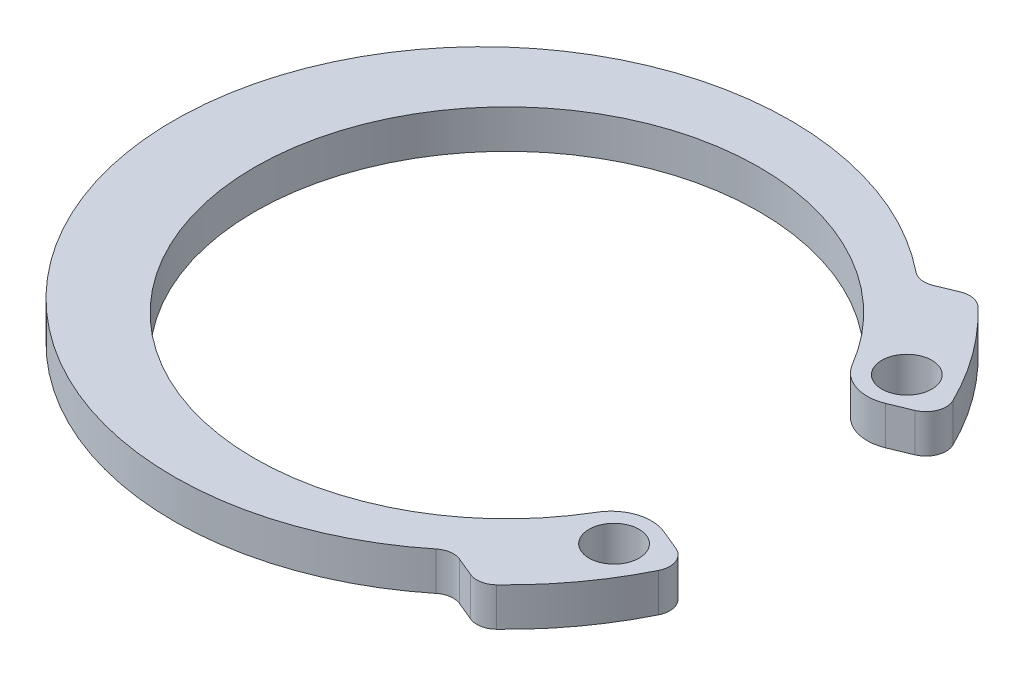
ISO-10303-21;
HEADER;
FILE_DESCRIPTION(('STEP AP214'),'2;1');
FILE_NAME('part.step','',(''),(''),'','','');
FILE_SCHEMA(('AUTOMOTIVE_DESIGN { 1 0 10303 214 1 1 1 1 }'));
ENDSEC;
DATA;
#1=APPLICATION_CONTEXT('core data for automotive mechanical design processes');
#2=APPLICATION_PROTOCOL_DEFINITION('international standard','automotive_design',2000,#1);
#3=PRODUCT_CONTEXT('',#1,'mechanical');
#4=PRODUCT('Part','Part','',(#3));
#5=PRODUCT_RELATED_PRODUCT_CATEGORY('part','',(#4));
#6=PRODUCT_DEFINITION_FORMATION('','',#4);
#7=PRODUCT_DEFINITION_CONTEXT('part definition',#1,'design');
#8=PRODUCT_DEFINITION('design','',#6,#7);
#9=PRODUCT_DEFINITION_SHAPE('','',#8);
#10=(LENGTH_UNIT() NAMED_UNIT(*) SI_UNIT(.MILLI.,.METRE.));
#11=(NAMED_UNIT(*) PLANE_ANGLE_UNIT() SI_UNIT($,.RADIAN.));
#12=(NAMED_UNIT(*) SI_UNIT($,.STERADIAN.) SOLID_ANGLE_UNIT());
#13=UNCERTAINTY_MEASURE_WITH_UNIT(LENGTH_MEASURE(1.E-05),#10,'distance_accuracy_value','');
#14=(GEOMETRIC_REPRESENTATION_CONTEXT(3) GLOBAL_UNCERTAINTY_ASSIGNED_CONTEXT((#13)) GLOBAL_UNIT_ASSIGNED_CONTEXT((#10,
#11,#12)) REPRESENTATION_CONTEXT('',''));
#15=CARTESIAN_POINT('',(0.,0.,0.));
#16=DIRECTION('',(0.,0.,1.));
#17=DIRECTION('',(1.,0.,0.));
#18=AXIS2_PLACEMENT_3D('',#15,#16,#17);
#19=CARTESIAN_POINT('',(5.61642550601752,0.5,5.87123407260824));
#20=DIRECTION('',(0.,1.,0.));
#21=DIRECTION('',(0.,0.,1.));
#22=AXIS2_PLACEMENT_3D('',#19,#20,#21);
#23=PLANE('',#22);
#24=CARTESIAN_POINT('',(6.58179306876173,0.5,3.80000000000001));
#25=DIRECTION('',(0.,1.,0.));
#26=DIRECTION('',(0.,0.,1.));
#27=AXIS2_PLACEMENT_3D('',#24,#25,#26);
#28=CIRCLE('',#27,0.65);
#29=CARTESIAN_POINT('',(6.58179306876173,0.5,4.45000000000001));
#30=VERTEX_POINT('',#29);
#31=EDGE_CURVE('E220',#30,#30,#28,.T.);
#32=ORIENTED_EDGE('',*,*,#31,.F.);
#33=EDGE_LOOP('',(#32));
#34=FACE_BOUND('',#33,.T.);
#35=CARTESIAN_POINT('',(5.61642550601752,0.5,5.87123407260824));
#36=DIRECTION('',(0.,1.,0.));
#37=DIRECTION('',(0.,0.,1.));
#38=AXIS2_PLACEMENT_3D('',#35,#36,#37);
#39=CIRCLE('',#38,0.524999999999999);
#40=CARTESIAN_POINT('',(5.41551670402585,0.5,6.35627082717666));
#41=VERTEX_POINT('',#40);
#42=CARTESIAN_POINT('',(5.9793330002525,0.5,6.25060612037677));
#43=VERTEX_POINT('',#42);
#44=EDGE_CURVE('E223',#41,#43,#39,.T.);
#45=ORIENTED_EDGE('',*,*,#44,.T.);
#46=CARTESIAN_POINT('',(0.,0.5,0.));
#47=DIRECTION('',(0.,1.,0.));
#48=DIRECTION('',(0.,0.,1.));
#49=AXIS2_PLACEMENT_3D('',#46,#47,#48);
#50=CIRCLE('',#49,8.65);
#51=CARTESIAN_POINT('',(7.76096693648027,0.5,3.81967174124427));
#52=VERTEX_POINT('',#51);
#53=EDGE_CURVE('E155',#43,#52,#50,.T.);
#54=ORIENTED_EDGE('',*,*,#53,.T.);
#55=CARTESIAN_POINT('',(7.28992559062453,0.5,3.58784195348089));
#56=DIRECTION('',(0.,1.,0.));
#57=DIRECTION('',(0.,0.,-1.));
#58=AXIS2_PLACEMENT_3D('',#55,#56,#57);
#59=CIRCLE('',#58,0.524999999999999);
#60=CARTESIAN_POINT('',(7.4908343926162,0.5,3.10280519891247));
#61=VERTEX_POINT('',#60);
#62=EDGE_CURVE('E226',#52,#61,#59,.T.);
#63=ORIENTED_EDGE('',*,*,#62,.T.);
#64=DIRECTION('',(-0.923879532511286,0.,-0.382683432365091));
#65=VECTOR('',#64,1.);
#66=CARTESIAN_POINT('',(6.95414992846274,0.5,2.88050321514516));
#67=LINE('',#66,#65);
#68=CARTESIAN_POINT('',(6.95414992846274,0.5,2.88050321514516));
#69=VERTEX_POINT('',#68);
#70=EDGE_CURVE('E228',#61,#69,#67,.T.);
#71=ORIENTED_EDGE('',*,*,#70,.T.);
#72=CARTESIAN_POINT('',(6.5523323244794,0.5,3.85057672428201));
#73=DIRECTION('',(0.,1.,0.));
#74=DIRECTION('',(0.,0.,1.));
#75=AXIS2_PLACEMENT_3D('',#72,#73,#74);
#76=CIRCLE('',#75,1.05);
#77=CARTESIAN_POINT('',(5.64707588491316,0.5,3.31858915053253));
#78=VERTEX_POINT('',#77);
#79=EDGE_CURVE('E230',#69,#78,#76,.T.);
#80=ORIENTED_EDGE('',*,*,#79,.T.);
#81=CARTESIAN_POINT('',(0.,0.5,0.));
#82=DIRECTION('',(0.,-1.,0.));
#83=DIRECTION('',(0.,0.,1.));
#84=AXIS2_PLACEMENT_3D('',#81,#82,#83);
#85=CIRCLE('',#84,6.55);
#86=CARTESIAN_POINT('',(5.64707588491317,0.5,-3.31858915053252));
#87=VERTEX_POINT('',#86);
#88=EDGE_CURVE('E232',#78,#87,#85,.T.);
#89=ORIENTED_EDGE('',*,*,#88,.T.);
#90=CARTESIAN_POINT('',(6.5523323244794,0.5,-3.85057672428201));
#91=DIRECTION('',(0.,1.,0.));
#92=DIRECTION('',(0.,0.,-1.));
#93=AXIS2_PLACEMENT_3D('',#90,#91,#92);
#94=CIRCLE('',#93,1.05);
#95=CARTESIAN_POINT('',(6.95414992846274,0.5,-2.88050321514516));
#96=VERTEX_POINT('',#95);
#97=EDGE_CURVE('E234',#87,#96,#94,.T.);
#98=ORIENTED_EDGE('',*,*,#97,.T.);
#99=DIRECTION('',(0.923879532511286,0.,-0.382683432365092));
#100=VECTOR('',#99,1.);
#101=CARTESIAN_POINT('',(6.95414992846274,0.5,-2.88050321514516));
#102=LINE('',#101,#100);
#103=CARTESIAN_POINT('',(7.4908343926162,0.5,-3.10280519891246));
#104=VERTEX_POINT('',#103);
#105=EDGE_CURVE('E236',#96,#104,#102,.T.);
#106=ORIENTED_EDGE('',*,*,#105,.T.);
#107=CARTESIAN_POINT('',(7.28992559062453,0.5,-3.58784195348089));
#108=DIRECTION('',(0.,1.,0.));
#109=DIRECTION('',(0.,0.,1.));
#110=AXIS2_PLACEMENT_3D('',#107,#108,#109);
#111=CIRCLE('',#110,0.525);
#112=CARTESIAN_POINT('',(7.76096693648027,0.5,-3.81967174124427));
#113=VERTEX_POINT('',#112);
#114=EDGE_CURVE('E238',#104,#113,#111,.T.);
#115=ORIENTED_EDGE('',*,*,#114,.T.);
#116=CARTESIAN_POINT('',(0.,0.5,0.));
#117=DIRECTION('',(0.,1.,0.));
#118=DIRECTION('',(0.,0.,-1.));
#119=AXIS2_PLACEMENT_3D('',#116,#117,#118);
#120=CIRCLE('',#119,8.65);
#121=CARTESIAN_POINT('',(5.97933300025249,0.5,-6.25060612037677));
#122=VERTEX_POINT('',#121);
#123=EDGE_CURVE('E240',#113,#122,#120,.T.);
#124=ORIENTED_EDGE('',*,*,#123,.T.);
#125=CARTESIAN_POINT('',(5.61642550601752,0.5,-5.87123407260824));
#126=DIRECTION('',(0.,1.,0.));
#127=DIRECTION('',(0.,0.,-1.));
#128=AXIS2_PLACEMENT_3D('',#125,#126,#127);
#129=CIRCLE('',#128,0.524999999999999);
#130=CARTESIAN_POINT('',(5.41551670402584,0.5,-6.35627082717666));
#131=VERTEX_POINT('',#130);
#132=EDGE_CURVE('E242',#122,#131,#129,.T.);
#133=ORIENTED_EDGE('',*,*,#132,.T.);
#134=DIRECTION('',(-0.923879532511287,0.,0.38268343236509));
#135=VECTOR('',#134,1.);
#136=CARTESIAN_POINT('',(4.92107566196852,0.5,-6.15146664176263));
#137=LINE('',#136,#135);
#138=CARTESIAN_POINT('',(4.92107566196851,0.5,-6.15146664176263));
#139=VERTEX_POINT('',#138);
#140=EDGE_CURVE('E244',#131,#139,#137,.T.);
#141=ORIENTED_EDGE('',*,*,#140,.T.);
#142=CARTESIAN_POINT('',(4.72016685997684,0.5,-6.63650339633106));
#143=DIRECTION('',(0.,-1.,0.));
#144=DIRECTION('',(0.,0.,1.));
#145=AXIS2_PLACEMENT_3D('',#142,#143,#144);
#146=CIRCLE('',#145,0.524999999999999);
#147=CARTESIAN_POINT('',(4.39019706640736,0.5,-6.2281592579726));
#148=VERTEX_POINT('',#147);
#149=EDGE_CURVE('E246',#139,#148,#146,.T.);
#150=ORIENTED_EDGE('',*,*,#149,.T.);
#151=CARTESIAN_POINT('',(-0.642578554990179,0.5,0.));
#152=DIRECTION('',(0.,1.,0.));
#153=DIRECTION('',(0.,0.,1.));
#154=AXIS2_PLACEMENT_3D('',#151,#152,#153);
#155=CIRCLE('',#154,8.00742144500982);
#156=CARTESIAN_POINT('',(4.39019706640737,0.5,6.22815925797259));
#157=VERTEX_POINT('',#156);
#158=EDGE_CURVE('E248',#148,#157,#155,.T.);
#159=ORIENTED_EDGE('',*,*,#158,.T.);
#160=CARTESIAN_POINT('',(4.72016685997685,0.5,6.63650339633105));
#161=DIRECTION('',(0.,-1.,0.));
#162=DIRECTION('',(0.,0.,-1.));
#163=AXIS2_PLACEMENT_3D('',#160,#161,#162);
#164=CIRCLE('',#163,0.524999999999999);
#165=CARTESIAN_POINT('',(4.92107566196852,0.5,6.15146664176263));
#166=VERTEX_POINT('',#165);
#167=EDGE_CURVE('E59',#157,#166,#164,.T.);
#168=ORIENTED_EDGE('',*,*,#167,.T.);
#169=DIRECTION('',(0.923879532511287,0.,0.382683432365089));
#170=VECTOR('',#169,1.);
#171=CARTESIAN_POINT('',(4.92107566196852,0.5,6.15146664176263));
#172=LINE('',#171,#170);
#173=EDGE_CURVE('E54',#166,#41,#172,.T.);
#174=ORIENTED_EDGE('',*,*,#173,.T.);
#175=EDGE_LOOP('',(#45,#54,#63,#71,#80,#89,#98,#106,#115,#124,#133,#141,#150,#159,#168,#174));
#176=FACE_BOUND('',#175,.T.);
#177=CARTESIAN_POINT('',(6.58179306876173,0.5,-3.80000000000001));
#178=DIRECTION('',(0.,1.,0.));
#179=DIRECTION('',(0.,0.,1.));
#180=AXIS2_PLACEMENT_3D('',#177,#178,#179);
#181=CIRCLE('',#180,0.65);
#182=CARTESIAN_POINT('',(6.58179306876173,0.5,-3.15000000000001));
#183=VERTEX_POINT('',#182);
#184=EDGE_CURVE('E217',#183,#183,#181,.T.);
#185=ORIENTED_EDGE('',*,*,#184,.F.);
#186=EDGE_LOOP('',(#185));
#187=FACE_BOUND('',#186,.T.);
#188=ADVANCED_FACE('F39',(#34,#176,#187),#23,.T.);
#189=CARTESIAN_POINT('',(5.61642550601752,0.5,5.87123407260824));
#190=DIRECTION('',(0.,-1.,0.));
#191=DIRECTION('',(0.,0.,-1.));
#192=AXIS2_PLACEMENT_3D('',#189,#190,#191);
#193=CYLINDRICAL_SURFACE('',#192,0.524999999999999);
#194=DIRECTION('',(0.,-1.,0.));
#195=VECTOR('',#194,1.);
#196=CARTESIAN_POINT('',(5.41551670402585,0.5,6.35627082717666));
#197=LINE('',#196,#195);
#198=CARTESIAN_POINT('',(5.41551670402585,-0.5,6.35627082717666));
#199=VERTEX_POINT('',#198);
#200=EDGE_CURVE('E170',#41,#199,#197,.T.);
#201=ORIENTED_EDGE('',*,*,#200,.T.);
#202=CARTESIAN_POINT('',(5.61642550601752,-0.5,5.87123407260824));
#203=DIRECTION('',(0.,1.,0.));
#204=DIRECTION('',(0.,0.,1.));
#205=AXIS2_PLACEMENT_3D('',#202,#203,#204);
#206=CIRCLE('',#205,0.524999999999999);
#207=CARTESIAN_POINT('',(5.9793330002525,-0.5,6.25060612037677));
#208=VERTEX_POINT('',#207);
#209=EDGE_CURVE('E164',#199,#208,#206,.T.);
#210=ORIENTED_EDGE('',*,*,#209,.T.);
#211=DIRECTION('',(0.,-1.,0.));
#212=VECTOR('',#211,1.);
#213=CARTESIAN_POINT('',(5.9793330002525,0.5,6.25060612037677));
#214=LINE('',#213,#212);
#215=EDGE_CURVE('E11',#43,#208,#214,.T.);
#216=ORIENTED_EDGE('',*,*,#215,.F.);
#217=ORIENTED_EDGE('',*,*,#44,.F.);
#218=EDGE_LOOP('',(#201,#210,#216,#217));
#219=FACE_BOUND('',#218,.T.);
#220=ADVANCED_FACE('F41',(#219),#193,.T.);
#221=CARTESIAN_POINT('',(0.,0.5,0.));
#222=DIRECTION('',(0.,-1.,0.));
#223=DIRECTION('',(0.,0.,-1.));
#224=AXIS2_PLACEMENT_3D('',#221,#222,#223);
#225=CYLINDRICAL_SURFACE('',#224,8.65);
#226=ORIENTED_EDGE('',*,*,#215,.T.);
#227=CARTESIAN_POINT('',(0.,-0.5,0.));
#228=DIRECTION('',(0.,1.,0.));
#229=DIRECTION('',(0.,0.,1.));
#230=AXIS2_PLACEMENT_3D('',#227,#228,#229);
#231=CIRCLE('',#230,8.65);
#232=CARTESIAN_POINT('',(7.76096693648027,-0.5,3.81967174124427));
#233=VERTEX_POINT('',#232);
#234=EDGE_CURVE('E154',#208,#233,#231,.T.);
#235=ORIENTED_EDGE('',*,*,#234,.T.);
#236=DIRECTION('',(0.,-1.,0.));
#237=VECTOR('',#236,1.);
#238=CARTESIAN_POINT('',(7.76096693648027,0.5,3.81967174124427));
#239=LINE('',#238,#237);
#240=EDGE_CURVE('E47',#52,#233,#239,.T.);
#241=ORIENTED_EDGE('',*,*,#240,.F.);
#242=ORIENTED_EDGE('',*,*,#53,.F.);
#243=EDGE_LOOP('',(#226,#235,#241,#242));
#244=FACE_BOUND('',#243,.T.);
#245=ADVANCED_FACE('F152',(#244),#225,.T.);
#246=CARTESIAN_POINT('',(7.28992559062453,0.5,3.58784195348089));
#247=DIRECTION('',(0.,-1.,0.));
#248=DIRECTION('',(0.,0.,-1.));
#249=AXIS2_PLACEMENT_3D('',#246,#247,#248);
#250=CYLINDRICAL_SURFACE('',#249,0.524999999999999);
#251=ORIENTED_EDGE('',*,*,#240,.T.);
#252=CARTESIAN_POINT('',(7.28992559062453,-0.5,3.58784195348089));
#253=DIRECTION('',(0.,1.,0.));
#254=DIRECTION('',(0.,0.,-1.));
#255=AXIS2_PLACEMENT_3D('',#252,#253,#254);
#256=CIRCLE('',#255,0.524999999999999);
#257=CARTESIAN_POINT('',(7.4908343926162,-0.5,3.10280519891247));
#258=VERTEX_POINT('',#257);
#259=EDGE_CURVE('E168',#233,#258,#256,.T.);
#260=ORIENTED_EDGE('',*,*,#259,.T.);
#261=DIRECTION('',(0.,-1.,0.));
#262=VECTOR('',#261,1.);
#263=CARTESIAN_POINT('',(7.4908343926162,0.5,3.10280519891247));
#264=LINE('',#263,#262);
#265=EDGE_CURVE('E277',#61,#258,#264,.T.);
#266=ORIENTED_EDGE('',*,*,#265,.F.);
#267=ORIENTED_EDGE('',*,*,#62,.F.);
#268=EDGE_LOOP('',(#251,#260,#266,#267));
#269=FACE_BOUND('',#268,.T.);
#270=ADVANCED_FACE('F280',(#269),#250,.T.);
#271=CARTESIAN_POINT('',(6.95414992846274,0.5,2.88050321514516));
#272=DIRECTION('',(-0.382683432365091,0.,0.923879532511286));
#273=DIRECTION('',(0.923879532511286,0.,0.382683432365091));
#274=AXIS2_PLACEMENT_3D('',#271,#272,#273);
#275=PLANE('',#274);
#276=ORIENTED_EDGE('',*,*,#265,.T.);
#277=DIRECTION('',(-0.923879532511286,0.,-0.382683432365091));
#278=VECTOR('',#277,1.);
#279=CARTESIAN_POINT('',(6.95414992846274,-0.5,2.88050321514516));
#280=LINE('',#279,#278);
#281=CARTESIAN_POINT('',(6.95414992846274,-0.5,2.88050321514516));
#282=VERTEX_POINT('',#281);
#283=EDGE_CURVE('E179',#258,#282,#280,.T.);
#284=ORIENTED_EDGE('',*,*,#283,.T.);
#285=DIRECTION('',(0.,-1.,0.));
#286=VECTOR('',#285,1.);
#287=CARTESIAN_POINT('',(6.95414992846274,0.5,2.88050321514516));
#288=LINE('',#287,#286);
#289=EDGE_CURVE('E275',#69,#282,#288,.T.);
#290=ORIENTED_EDGE('',*,*,#289,.F.);
#291=ORIENTED_EDGE('',*,*,#70,.F.);
#292=EDGE_LOOP('',(#276,#284,#290,#291));
#293=FACE_BOUND('',#292,.T.);
#294=ADVANCED_FACE('F288',(#293),#275,.F.);
#295=CARTESIAN_POINT('',(6.5523323244794,0.5,3.85057672428201));
#296=DIRECTION('',(0.,-1.,0.));
#297=DIRECTION('',(0.,0.,-1.));
#298=AXIS2_PLACEMENT_3D('',#295,#296,#297);
#299=CYLINDRICAL_SURFACE('',#298,1.05);
#300=ORIENTED_EDGE('',*,*,#289,.T.);
#301=CARTESIAN_POINT('',(6.5523323244794,-0.5,3.85057672428201));
#302=DIRECTION('',(0.,1.,0.));
#303=DIRECTION('',(0.,0.,1.));
#304=AXIS2_PLACEMENT_3D('',#301,#302,#303);
#305=CIRCLE('',#304,1.05);
#306=CARTESIAN_POINT('',(5.64707588491316,-0.5,3.31858915053253));
#307=VERTEX_POINT('',#306);
#308=EDGE_CURVE('E182',#282,#307,#305,.T.);
#309=ORIENTED_EDGE('',*,*,#308,.T.);
#310=DIRECTION('',(0.,-1.,0.));
#311=VECTOR('',#310,1.);
#312=CARTESIAN_POINT('',(5.64707588491316,0.5,3.31858915053253));
#313=LINE('',#312,#311);
#314=EDGE_CURVE('E273',#78,#307,#313,.T.);
#315=ORIENTED_EDGE('',*,*,#314,.F.);
#316=ORIENTED_EDGE('',*,*,#79,.F.);
#317=EDGE_LOOP('',(#300,#309,#315,#316));
#318=FACE_BOUND('',#317,.T.);
#319=ADVANCED_FACE('F291',(#318),#299,.T.);
#320=CARTESIAN_POINT('',(0.,0.5,0.));
#321=DIRECTION('',(0.,-1.,0.));
#322=DIRECTION('',(0.,0.,-1.));
#323=AXIS2_PLACEMENT_3D('',#320,#321,#322);
#324=CYLINDRICAL_SURFACE('',#323,6.55);
#325=ORIENTED_EDGE('',*,*,#314,.T.);
#326=CARTESIAN_POINT('',(0.,-0.5,0.));
#327=DIRECTION('',(0.,-1.,0.));
#328=DIRECTION('',(0.,0.,1.));
#329=AXIS2_PLACEMENT_3D('',#326,#327,#328);
#330=CIRCLE('',#329,6.55);
#331=CARTESIAN_POINT('',(5.64707588491317,-0.5,-3.31858915053252));
#332=VERTEX_POINT('',#331);
#333=EDGE_CURVE('E185',#307,#332,#330,.T.);
#334=ORIENTED_EDGE('',*,*,#333,.T.);
#335=DIRECTION('',(0.,-1.,0.));
#336=VECTOR('',#335,1.);
#337=CARTESIAN_POINT('',(5.64707588491317,0.5,-3.31858915053252));
#338=LINE('',#337,#336);
#339=EDGE_CURVE('E271',#87,#332,#338,.T.);
#340=ORIENTED_EDGE('',*,*,#339,.F.);
#341=ORIENTED_EDGE('',*,*,#88,.F.);
#342=EDGE_LOOP('',(#325,#334,#340,#341));
#343=FACE_BOUND('',#342,.T.);
#344=ADVANCED_FACE('F296',(#343),#324,.F.);
#345=CARTESIAN_POINT('',(6.5523323244794,0.5,-3.85057672428201));
#346=DIRECTION('',(0.,-1.,0.));
#347=DIRECTION('',(0.,0.,-1.));
#348=AXIS2_PLACEMENT_3D('',#345,#346,#347);
#349=CYLINDRICAL_SURFACE('',#348,1.05);
#350=ORIENTED_EDGE('',*,*,#339,.T.);
#351=CARTESIAN_POINT('',(6.5523323244794,-0.5,-3.85057672428201));
#352=DIRECTION('',(0.,1.,0.));
#353=DIRECTION('',(0.,0.,-1.));
#354=AXIS2_PLACEMENT_3D('',#351,#352,#353);
#355=CIRCLE('',#354,1.05);
#356=CARTESIAN_POINT('',(6.95414992846274,-0.5,-2.88050321514516));
#357=VERTEX_POINT('',#356);
#358=EDGE_CURVE('E188',#332,#357,#355,.T.);
#359=ORIENTED_EDGE('',*,*,#358,.T.);
#360=DIRECTION('',(0.,-1.,0.));
#361=VECTOR('',#360,1.);
#362=CARTESIAN_POINT('',(6.95414992846274,0.5,-2.88050321514516));
#363=LINE('',#362,#361);
#364=EDGE_CURVE('E269',#96,#357,#363,.T.);
#365=ORIENTED_EDGE('',*,*,#364,.F.);
#366=ORIENTED_EDGE('',*,*,#97,.F.);
#367=EDGE_LOOP('',(#350,#359,#365,#366));
#368=FACE_BOUND('',#367,.T.);
#369=ADVANCED_FACE('F302',(#368),#349,.T.);
#370=CARTESIAN_POINT('',(6.95414992846274,0.5,-2.88050321514516));
#371=DIRECTION('',(-0.382683432365092,0.,-0.923879532511286));
#372=DIRECTION('',(-0.923879532511286,0.,0.382683432365092));
#373=AXIS2_PLACEMENT_3D('',#370,#371,#372);
#374=PLANE('',#373);
#375=ORIENTED_EDGE('',*,*,#364,.T.);
#376=DIRECTION('',(0.923879532511286,0.,-0.382683432365092));
#377=VECTOR('',#376,1.);
#378=CARTESIAN_POINT('',(6.95414992846274,-0.5,-2.88050321514516));
#379=LINE('',#378,#377);
#380=CARTESIAN_POINT('',(7.4908343926162,-0.5,-3.10280519891246));
#381=VERTEX_POINT('',#380);
#382=EDGE_CURVE('E191',#357,#381,#379,.T.);
#383=ORIENTED_EDGE('',*,*,#382,.T.);
#384=DIRECTION('',(0.,-1.,0.));
#385=VECTOR('',#384,1.);
#386=CARTESIAN_POINT('',(7.4908343926162,0.5,-3.10280519891246));
#387=LINE('',#386,#385);
#388=EDGE_CURVE('E267',#104,#381,#387,.T.);
#389=ORIENTED_EDGE('',*,*,#388,.F.);
#390=ORIENTED_EDGE('',*,*,#105,.F.);
#391=EDGE_LOOP('',(#375,#383,#389,#390));
#392=FACE_BOUND('',#391,.T.);
#393=ADVANCED_FACE('F306',(#392),#374,.F.);
#394=CARTESIAN_POINT('',(7.28992559062453,0.5,-3.58784195348089));
#395=DIRECTION('',(0.,-1.,0.));
#396=DIRECTION('',(0.,0.,-1.));
#397=AXIS2_PLACEMENT_3D('',#394,#395,#396);
#398=CYLINDRICAL_SURFACE('',#397,0.525);
#399=ORIENTED_EDGE('',*,*,#388,.T.);
#400=CARTESIAN_POINT('',(7.28992559062453,-0.5,-3.58784195348089));
#401=DIRECTION('',(0.,1.,0.));
#402=DIRECTION('',(0.,0.,1.));
#403=AXIS2_PLACEMENT_3D('',#400,#401,#402);
#404=CIRCLE('',#403,0.525);
#405=CARTESIAN_POINT('',(7.76096693648027,-0.5,-3.81967174124427));
#406=VERTEX_POINT('',#405);
#407=EDGE_CURVE('E194',#381,#406,#404,.T.);
#408=ORIENTED_EDGE('',*,*,#407,.T.);
#409=DIRECTION('',(0.,-1.,0.));
#410=VECTOR('',#409,1.);
#411=CARTESIAN_POINT('',(7.76096693648027,0.5,-3.81967174124427));
#412=LINE('',#411,#410);
#413=EDGE_CURVE('E265',#113,#406,#412,.T.);
#414=ORIENTED_EDGE('',*,*,#413,.F.);
#415=ORIENTED_EDGE('',*,*,#114,.F.);
#416=EDGE_LOOP('',(#399,#408,#414,#415));
#417=FACE_BOUND('',#416,.T.);
#418=ADVANCED_FACE('F311',(#417),#398,.T.);
#419=CARTESIAN_POINT('',(0.,0.5,0.));
#420=DIRECTION('',(0.,-1.,0.));
#421=DIRECTION('',(0.,0.,-1.));
#422=AXIS2_PLACEMENT_3D('',#419,#420,#421);
#423=CYLINDRICAL_SURFACE('',#422,8.65);
#424=ORIENTED_EDGE('',*,*,#413,.T.);
#425=CARTESIAN_POINT('',(0.,-0.5,0.));
#426=DIRECTION('',(0.,1.,0.));
#427=DIRECTION('',(0.,0.,-1.));
#428=AXIS2_PLACEMENT_3D('',#425,#426,#427);
#429=CIRCLE('',#428,8.65);
#430=CARTESIAN_POINT('',(5.97933300025249,-0.5,-6.25060612037677));
#431=VERTEX_POINT('',#430);
#432=EDGE_CURVE('E197',#406,#431,#429,.T.);
#433=ORIENTED_EDGE('',*,*,#432,.T.);
#434=DIRECTION('',(0.,-1.,0.));
#435=VECTOR('',#434,1.);
#436=CARTESIAN_POINT('',(5.97933300025249,0.5,-6.25060612037677));
#437=LINE('',#436,#435);
#438=EDGE_CURVE('E263',#122,#431,#437,.T.);
#439=ORIENTED_EDGE('',*,*,#438,.F.);
#440=ORIENTED_EDGE('',*,*,#123,.F.);
#441=EDGE_LOOP('',(#424,#433,#439,#440));
#442=FACE_BOUND('',#441,.T.);
#443=ADVANCED_FACE('F317',(#442),#423,.T.);
#444=CARTESIAN_POINT('',(5.61642550601752,0.5,-5.87123407260824));
#445=DIRECTION('',(0.,-1.,0.));
#446=DIRECTION('',(0.,0.,-1.));
#447=AXIS2_PLACEMENT_3D('',#444,#445,#446);
#448=CYLINDRICAL_SURFACE('',#447,0.524999999999999);
#449=ORIENTED_EDGE('',*,*,#438,.T.);
#450=CARTESIAN_POINT('',(5.61642550601752,-0.5,-5.87123407260824));
#451=DIRECTION('',(0.,1.,0.));
#452=DIRECTION('',(0.,0.,-1.));
#453=AXIS2_PLACEMENT_3D('',#450,#451,#452);
#454=CIRCLE('',#453,0.524999999999999);
#455=CARTESIAN_POINT('',(5.41551670402584,-0.5,-6.35627082717666));
#456=VERTEX_POINT('',#455);
#457=EDGE_CURVE('E200',#431,#456,#454,.T.);
#458=ORIENTED_EDGE('',*,*,#457,.T.);
#459=DIRECTION('',(0.,-1.,0.));
#460=VECTOR('',#459,1.);
#461=CARTESIAN_POINT('',(5.41551670402584,0.5,-6.35627082717666));
#462=LINE('',#461,#460);
#463=EDGE_CURVE('E261',#131,#456,#462,.T.);
#464=ORIENTED_EDGE('',*,*,#463,.F.);
#465=ORIENTED_EDGE('',*,*,#132,.F.);
#466=EDGE_LOOP('',(#449,#458,#464,#465));
#467=FACE_BOUND('',#466,.T.);
#468=ADVANCED_FACE('F321',(#467),#448,.T.);
#469=CARTESIAN_POINT('',(4.92107566196852,0.5,-6.15146664176263));
#470=DIRECTION('',(0.38268343236509,0.,0.923879532511287));
#471=DIRECTION('',(0.923879532511287,0.,-0.38268343236509));
#472=AXIS2_PLACEMENT_3D('',#469,#470,#471);
#473=PLANE('',#472);
#474=ORIENTED_EDGE('',*,*,#463,.T.);
#475=DIRECTION('',(-0.923879532511287,0.,0.38268343236509));
#476=VECTOR('',#475,1.);
#477=CARTESIAN_POINT('',(4.92107566196852,-0.5,-6.15146664176263));
#478=LINE('',#477,#476);
#479=CARTESIAN_POINT('',(4.92107566196851,-0.5,-6.15146664176263));
#480=VERTEX_POINT('',#479);
#481=EDGE_CURVE('E203',#456,#480,#478,.T.);
#482=ORIENTED_EDGE('',*,*,#481,.T.);
#483=DIRECTION('',(0.,-1.,0.));
#484=VECTOR('',#483,1.);
#485=CARTESIAN_POINT('',(4.92107566196851,0.5,-6.15146664176263));
#486=LINE('',#485,#484);
#487=EDGE_CURVE('E259',#139,#480,#486,.T.);
#488=ORIENTED_EDGE('',*,*,#487,.F.);
#489=ORIENTED_EDGE('',*,*,#140,.F.);
#490=EDGE_LOOP('',(#474,#482,#488,#489));
#491=FACE_BOUND('',#490,.T.);
#492=ADVANCED_FACE('F326',(#491),#473,.F.);
#493=CARTESIAN_POINT('',(4.72016685997684,0.5,-6.63650339633106));
#494=DIRECTION('',(0.,-1.,0.));
#495=DIRECTION('',(0.,0.,-1.));
#496=AXIS2_PLACEMENT_3D('',#493,#494,#495);
#497=CYLINDRICAL_SURFACE('',#496,0.524999999999999);
#498=ORIENTED_EDGE('',*,*,#487,.T.);
#499=CARTESIAN_POINT('',(4.72016685997684,-0.5,-6.63650339633106));
#500=DIRECTION('',(0.,-1.,0.));
#501=DIRECTION('',(0.,0.,1.));
#502=AXIS2_PLACEMENT_3D('',#499,#500,#501);
#503=CIRCLE('',#502,0.524999999999999);
#504=CARTESIAN_POINT('',(4.39019706640736,-0.5,-6.2281592579726));
#505=VERTEX_POINT('',#504);
#506=EDGE_CURVE('E206',#480,#505,#503,.T.);
#507=ORIENTED_EDGE('',*,*,#506,.T.);
#508=DIRECTION('',(0.,-1.,0.));
#509=VECTOR('',#508,1.);
#510=CARTESIAN_POINT('',(4.39019706640736,0.5,-6.2281592579726));
#511=LINE('',#510,#509);
#512=EDGE_CURVE('E257',#148,#505,#511,.T.);
#513=ORIENTED_EDGE('',*,*,#512,.F.);
#514=ORIENTED_EDGE('',*,*,#149,.F.);
#515=EDGE_LOOP('',(#498,#507,#513,#514));
#516=FACE_BOUND('',#515,.T.);
#517=ADVANCED_FACE('F332',(#516),#497,.F.);
#518=CARTESIAN_POINT('',(-0.642578554990179,0.5,0.));
#519=DIRECTION('',(0.,-1.,0.));
#520=DIRECTION('',(0.,0.,-1.));
#521=AXIS2_PLACEMENT_3D('',#518,#519,#520);
#522=CYLINDRICAL_SURFACE('',#521,8.00742144500982);
#523=ORIENTED_EDGE('',*,*,#512,.T.);
#524=CARTESIAN_POINT('',(-0.642578554990179,-0.5,0.));
#525=DIRECTION('',(0.,1.,0.));
#526=DIRECTION('',(0.,0.,1.));
#527=AXIS2_PLACEMENT_3D('',#524,#525,#526);
#528=CIRCLE('',#527,8.00742144500982);
#529=CARTESIAN_POINT('',(4.39019706640737,-0.5,6.22815925797259));
#530=VERTEX_POINT('',#529);
#531=EDGE_CURVE('E209',#505,#530,#528,.T.);
#532=ORIENTED_EDGE('',*,*,#531,.T.);
#533=DIRECTION('',(0.,-1.,0.));
#534=VECTOR('',#533,1.);
#535=CARTESIAN_POINT('',(4.39019706640737,0.5,6.22815925797259));
#536=LINE('',#535,#534);
#537=EDGE_CURVE('E255',#157,#530,#536,.T.);
#538=ORIENTED_EDGE('',*,*,#537,.F.);
#539=ORIENTED_EDGE('',*,*,#158,.F.);
#540=EDGE_LOOP('',(#523,#532,#538,#539));
#541=FACE_BOUND('',#540,.T.);
#542=ADVANCED_FACE('F336',(#541),#522,.T.);
#543=CARTESIAN_POINT('',(4.72016685997685,0.5,6.63650339633105));
#544=DIRECTION('',(0.,-1.,0.));
#545=DIRECTION('',(0.,0.,-1.));
#546=AXIS2_PLACEMENT_3D('',#543,#544,#545);
#547=CYLINDRICAL_SURFACE('',#546,0.524999999999999);
#548=ORIENTED_EDGE('',*,*,#537,.T.);
#549=CARTESIAN_POINT('',(4.72016685997685,-0.5,6.63650339633105));
#550=DIRECTION('',(0.,-1.,0.));
#551=DIRECTION('',(0.,0.,-1.));
#552=AXIS2_PLACEMENT_3D('',#549,#550,#551);
#553=CIRCLE('',#552,0.524999999999999);
#554=CARTESIAN_POINT('',(4.92107566196852,-0.5,6.15146664176263));
#555=VERTEX_POINT('',#554);
#556=EDGE_CURVE('E212',#530,#555,#553,.T.);
#557=ORIENTED_EDGE('',*,*,#556,.T.);
#558=DIRECTION('',(0.,-1.,0.));
#559=VECTOR('',#558,1.);
#560=CARTESIAN_POINT('',(4.92107566196852,0.5,6.15146664176263));
#561=LINE('',#560,#559);
#562=EDGE_CURVE('E253',#166,#555,#561,.T.);
#563=ORIENTED_EDGE('',*,*,#562,.F.);
#564=ORIENTED_EDGE('',*,*,#167,.F.);
#565=EDGE_LOOP('',(#548,#557,#563,#564));
#566=FACE_BOUND('',#565,.T.);
#567=ADVANCED_FACE('F339',(#566),#547,.F.);
#568=CARTESIAN_POINT('',(4.92107566196852,0.5,6.15146664176263));
#569=DIRECTION('',(0.382683432365089,0.,-0.923879532511287));
#570=DIRECTION('',(-0.923879532511287,0.,-0.382683432365089));
#571=AXIS2_PLACEMENT_3D('',#568,#569,#570);
#572=PLANE('',#571);
#573=ORIENTED_EDGE('',*,*,#562,.T.);
#574=DIRECTION('',(0.923879532511287,0.,0.382683432365089));
#575=VECTOR('',#574,1.);
#576=CARTESIAN_POINT('',(4.92107566196852,-0.5,6.15146664176263));
#577=LINE('',#576,#575);
#578=EDGE_CURVE('E215',#555,#199,#577,.T.);
#579=ORIENTED_EDGE('',*,*,#578,.T.);
#580=ORIENTED_EDGE('',*,*,#200,.F.);
#581=ORIENTED_EDGE('',*,*,#173,.F.);
#582=EDGE_LOOP('',(#573,#579,#580,#581));
#583=FACE_BOUND('',#582,.T.);
#584=ADVANCED_FACE('F341',(#583),#572,.F.);
#585=CARTESIAN_POINT('',(6.58179306876173,0.5,3.80000000000001));
#586=DIRECTION('',(0.,-1.,0.));
#587=DIRECTION('',(0.,0.,-1.));
#588=AXIS2_PLACEMENT_3D('',#585,#586,#587);
#589=CYLINDRICAL_SURFACE('',#588,0.65);
#590=ORIENTED_EDGE('',*,*,#31,.T.);
#591=EDGE_LOOP('',(#590));
#592=FACE_BOUND('',#591,.T.);
#593=CARTESIAN_POINT('',(6.58179306876173,-0.5,3.80000000000001));
#594=DIRECTION('',(0.,1.,0.));
#595=DIRECTION('',(0.,0.,1.));
#596=AXIS2_PLACEMENT_3D('',#593,#594,#595);
#597=CIRCLE('',#596,0.65);
#598=CARTESIAN_POINT('',(6.58179306876173,-0.5,4.45000000000001));
#599=VERTEX_POINT('',#598);
#600=EDGE_CURVE('E171',#599,#599,#597,.T.);
#601=ORIENTED_EDGE('',*,*,#600,.F.);
#602=EDGE_LOOP('',(#601));
#603=FACE_BOUND('',#602,.T.);
#604=ADVANCED_FACE('F343',(#592,#603),#589,.F.);
#605=CARTESIAN_POINT('',(6.58179306876173,0.5,-3.80000000000001));
#606=DIRECTION('',(0.,-1.,0.));
#607=DIRECTION('',(0.,0.,-1.));
#608=AXIS2_PLACEMENT_3D('',#605,#606,#607);
#609=CYLINDRICAL_SURFACE('',#608,0.65);
#610=ORIENTED_EDGE('',*,*,#184,.T.);
#611=EDGE_LOOP('',(#610));
#612=FACE_BOUND('',#611,.T.);
#613=CARTESIAN_POINT('',(6.58179306876173,-0.5,-3.80000000000001));
#614=DIRECTION('',(0.,1.,0.));
#615=DIRECTION('',(0.,0.,1.));
#616=AXIS2_PLACEMENT_3D('',#613,#614,#615);
#617=CIRCLE('',#616,0.65);
#618=CARTESIAN_POINT('',(6.58179306876173,-0.5,-3.15000000000001));
#619=VERTEX_POINT('',#618);
#620=EDGE_CURVE('E174',#619,#619,#617,.T.);
#621=ORIENTED_EDGE('',*,*,#620,.F.);
#622=EDGE_LOOP('',(#621));
#623=FACE_BOUND('',#622,.T.);
#624=ADVANCED_FACE('F349',(#612,#623),#609,.F.);
#625=CARTESIAN_POINT('',(5.61642550601752,-0.5,5.87123407260824));
#626=DIRECTION('',(0.,1.,0.));
#627=DIRECTION('',(0.,0.,1.));
#628=AXIS2_PLACEMENT_3D('',#625,#626,#627);
#629=PLANE('',#628);
#630=ORIENTED_EDGE('',*,*,#620,.T.);
#631=EDGE_LOOP('',(#630));
#632=FACE_BOUND('',#631,.T.);
#633=ORIENTED_EDGE('',*,*,#600,.T.);
#634=EDGE_LOOP('',(#633));
#635=FACE_BOUND('',#634,.T.);
#636=ORIENTED_EDGE('',*,*,#209,.F.);
#637=ORIENTED_EDGE('',*,*,#578,.F.);
#638=ORIENTED_EDGE('',*,*,#556,.F.);
#639=ORIENTED_EDGE('',*,*,#531,.F.);
#640=ORIENTED_EDGE('',*,*,#506,.F.);
#641=ORIENTED_EDGE('',*,*,#481,.F.);
#642=ORIENTED_EDGE('',*,*,#457,.F.);
#643=ORIENTED_EDGE('',*,*,#432,.F.);
#644=ORIENTED_EDGE('',*,*,#407,.F.);
#645=ORIENTED_EDGE('',*,*,#382,.F.);
#646=ORIENTED_EDGE('',*,*,#358,.F.);
#647=ORIENTED_EDGE('',*,*,#333,.F.);
#648=ORIENTED_EDGE('',*,*,#308,.F.);
#649=ORIENTED_EDGE('',*,*,#283,.F.);
#650=ORIENTED_EDGE('',*,*,#259,.F.);
#651=ORIENTED_EDGE('',*,*,#234,.F.);
#652=EDGE_LOOP('',(#636,#637,#638,#639,#640,#641,#642,#643,#644,#645,#646,#647,#648,#649,#650,#651));
#653=FACE_BOUND('',#652,.T.);
#654=ADVANCED_FACE('F162',(#632,#635,#653),#629,.F.);
#655=CLOSED_SHELL('',(#188,#220,#245,#270,#294,#319,#344,#369,#393,#418,#443,#468,#492,#517,
#542,#567,#584,#604,#624,#654));
#656=MANIFOLD_SOLID_BREP('B2',#655);
#657=ADVANCED_BREP_SHAPE_REPRESENTATION('',(#18,#656),#14);
#658=SHAPE_DEFINITION_REPRESENTATION(#9,#657);
ENDSEC;
END-ISO-10303-21;
